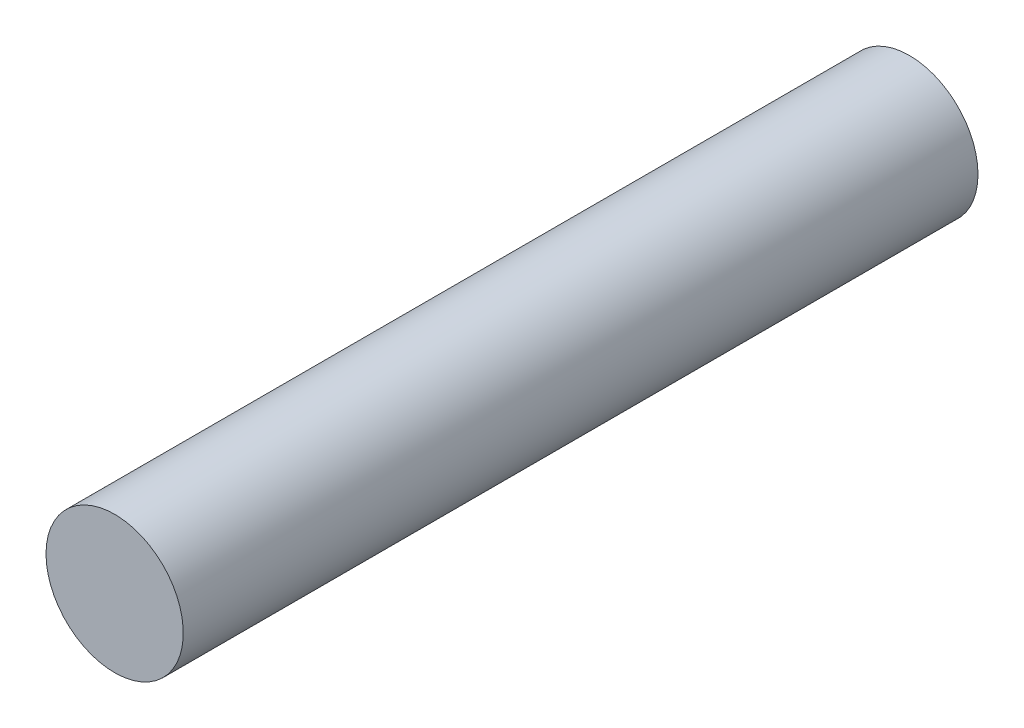
ISO-10303-21;
HEADER;
FILE_DESCRIPTION(('STEP AP214'),'2;1');
FILE_NAME('part.step','',(''),(''),'','','');
FILE_SCHEMA(('AUTOMOTIVE_DESIGN { 1 0 10303 214 1 1 1 1 }'));
ENDSEC;
DATA;
#1=APPLICATION_CONTEXT('core data for automotive mechanical design processes');
#2=APPLICATION_PROTOCOL_DEFINITION('international standard','automotive_design',2000,#1);
#3=PRODUCT_CONTEXT('',#1,'mechanical');
#4=PRODUCT('Part','Part','',(#3));
#5=PRODUCT_RELATED_PRODUCT_CATEGORY('part','',(#4));
#6=PRODUCT_DEFINITION_FORMATION('','',#4);
#7=PRODUCT_DEFINITION_CONTEXT('part definition',#1,'design');
#8=PRODUCT_DEFINITION('design','',#6,#7);
#9=PRODUCT_DEFINITION_SHAPE('','',#8);
#10=(LENGTH_UNIT() NAMED_UNIT(*) SI_UNIT(.MILLI.,.METRE.));
#11=(NAMED_UNIT(*) PLANE_ANGLE_UNIT() SI_UNIT($,.RADIAN.));
#12=(NAMED_UNIT(*) SI_UNIT($,.STERADIAN.) SOLID_ANGLE_UNIT());
#13=UNCERTAINTY_MEASURE_WITH_UNIT(LENGTH_MEASURE(1.E-05),#10,'distance_accuracy_value','');
#14=(GEOMETRIC_REPRESENTATION_CONTEXT(3) GLOBAL_UNCERTAINTY_ASSIGNED_CONTEXT((#13)) GLOBAL_UNIT_ASSIGNED_CONTEXT((#10,
#11,#12)) REPRESENTATION_CONTEXT('',''));
#15=CARTESIAN_POINT('',(0.,0.,0.));
#16=DIRECTION('',(0.,0.,1.));
#17=DIRECTION('',(1.,0.,0.));
#18=AXIS2_PLACEMENT_3D('',#15,#16,#17);
#19=CARTESIAN_POINT('',(0.,0.,66.5));
#20=DIRECTION('',(0.,0.,-1.));
#21=DIRECTION('',(-1.,0.,0.));
#22=AXIS2_PLACEMENT_3D('',#19,#20,#21);
#23=CYLINDRICAL_SURFACE('',#22,2.413);
#24=CARTESIAN_POINT('',(0.,0.,-66.5));
#25=DIRECTION('',(0.,0.,1.));
#26=DIRECTION('',(1.,0.,0.));
#27=AXIS2_PLACEMENT_3D('',#24,#25,#26);
#28=CIRCLE('',#27,2.413);
#29=CARTESIAN_POINT('',(2.413,0.,-66.5));
#30=VERTEX_POINT('',#29);
#31=EDGE_CURVE('E41',#30,#30,#28,.T.);
#32=ORIENTED_EDGE('',*,*,#31,.T.);
#33=EDGE_LOOP('',(#32));
#34=FACE_BOUND('',#33,.T.);
#35=CARTESIAN_POINT('',(0.,0.,-38.56));
#36=DIRECTION('',(0.,0.,-1.));
#37=DIRECTION('',(-1.,0.,0.));
#38=AXIS2_PLACEMENT_3D('',#35,#36,#37);
#39=CIRCLE('',#38,2.413);
#40=CARTESIAN_POINT('',(-2.413,0.,-38.56));
#41=VERTEX_POINT('',#40);
#42=EDGE_CURVE('E10',#41,#41,#39,.T.);
#43=ORIENTED_EDGE('',*,*,#42,.T.);
#44=EDGE_LOOP('',(#43));
#45=FACE_BOUND('',#44,.T.);
#46=ADVANCED_FACE('F35',(#34,#45),#23,.T.);
#47=CARTESIAN_POINT('',(0.,0.,-66.5));
#48=DIRECTION('',(0.,0.,1.));
#49=DIRECTION('',(1.,0.,0.));
#50=AXIS2_PLACEMENT_3D('',#47,#48,#49);
#51=PLANE('',#50);
#52=ORIENTED_EDGE('',*,*,#31,.F.);
#53=EDGE_LOOP('',(#52));
#54=FACE_BOUND('',#53,.T.);
#55=ADVANCED_FACE('F48',(#54),#51,.F.);
#56=CARTESIAN_POINT('',(-2.413,-2.413,-38.56));
#57=DIRECTION('',(0.,0.,-1.));
#58=DIRECTION('',(-1.,0.,0.));
#59=AXIS2_PLACEMENT_3D('',#56,#57,#58);
#60=PLANE('',#59);
#61=ORIENTED_EDGE('',*,*,#42,.F.);
#62=EDGE_LOOP('',(#61));
#63=FACE_BOUND('',#62,.T.);
#64=ADVANCED_FACE('F50',(#63),#60,.F.);
#65=CLOSED_SHELL('',(#46,#55,#64));
#66=MANIFOLD_SOLID_BREP('B2',#65);
#67=ADVANCED_BREP_SHAPE_REPRESENTATION('',(#18,#66),#14);
#68=SHAPE_DEFINITION_REPRESENTATION(#9,#67);
ENDSEC;
END-ISO-10303-21;
